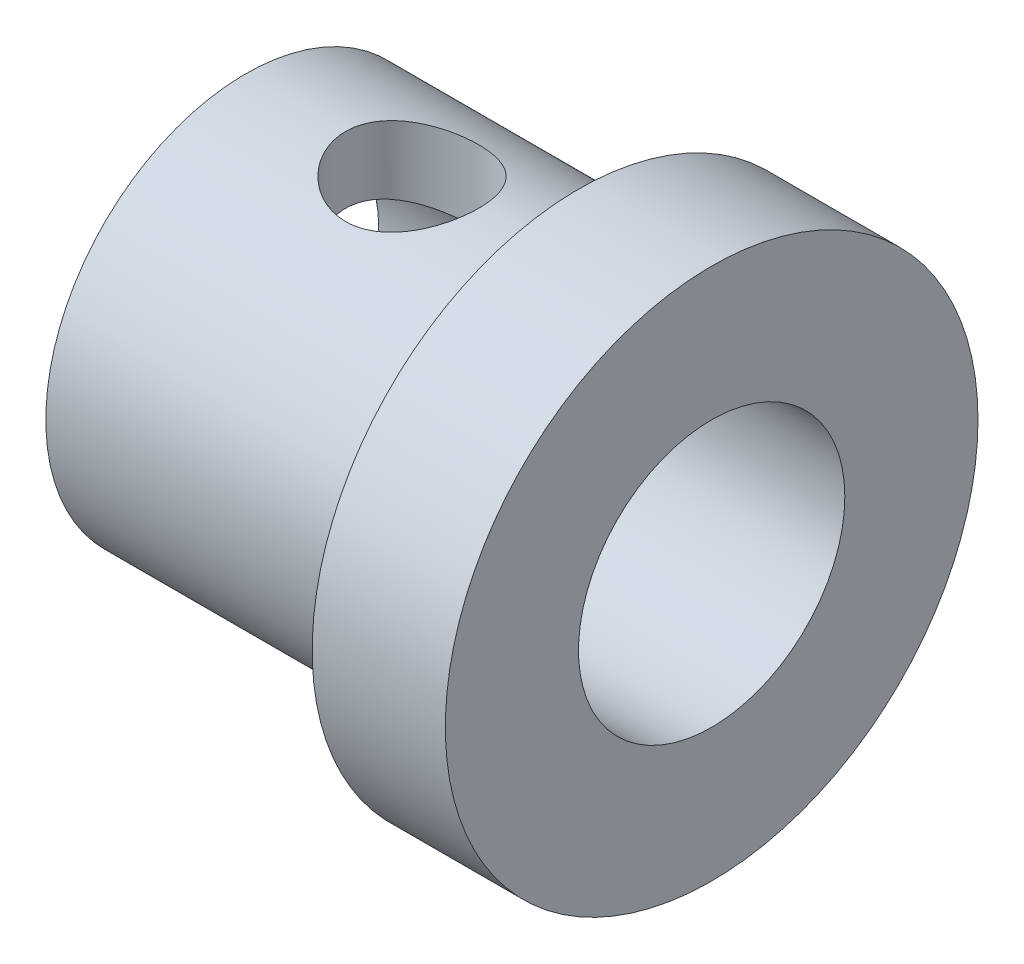
ISO-10303-21;
HEADER;
FILE_DESCRIPTION(('STEP AP214'),'2;1');
FILE_NAME('part.step','',(''),(''),'','','');
FILE_SCHEMA(('AUTOMOTIVE_DESIGN { 1 0 10303 214 1 1 1 1 }'));
ENDSEC;
DATA;
#1=APPLICATION_CONTEXT('core data for automotive mechanical design processes');
#2=APPLICATION_PROTOCOL_DEFINITION('international standard','automotive_design',2000,#1);
#3=PRODUCT_CONTEXT('',#1,'mechanical');
#4=PRODUCT('Part','Part','',(#3));
#5=PRODUCT_RELATED_PRODUCT_CATEGORY('part','',(#4));
#6=PRODUCT_DEFINITION_FORMATION('','',#4);
#7=PRODUCT_DEFINITION_CONTEXT('part definition',#1,'design');
#8=PRODUCT_DEFINITION('design','',#6,#7);
#9=PRODUCT_DEFINITION_SHAPE('','',#8);
#10=(LENGTH_UNIT() NAMED_UNIT(*) SI_UNIT(.MILLI.,.METRE.));
#11=(NAMED_UNIT(*) PLANE_ANGLE_UNIT() SI_UNIT($,.RADIAN.));
#12=(NAMED_UNIT(*) SI_UNIT($,.STERADIAN.) SOLID_ANGLE_UNIT());
#13=UNCERTAINTY_MEASURE_WITH_UNIT(LENGTH_MEASURE(1.E-05),#10,'distance_accuracy_value','');
#14=(GEOMETRIC_REPRESENTATION_CONTEXT(3) GLOBAL_UNCERTAINTY_ASSIGNED_CONTEXT((#13)) GLOBAL_UNIT_ASSIGNED_CONTEXT((#10,
#11,#12)) REPRESENTATION_CONTEXT('',''));
#15=CARTESIAN_POINT('',(0.,0.,0.));
#16=DIRECTION('',(0.,0.,1.));
#17=DIRECTION('',(1.,0.,0.));
#18=AXIS2_PLACEMENT_3D('',#15,#16,#17);
#19=CARTESIAN_POINT('',(3.5,0.,0.));
#20=DIRECTION('',(-1.,0.,0.));
#21=DIRECTION('',(0.,0.,1.));
#22=AXIS2_PLACEMENT_3D('',#19,#20,#21);
#23=CYLINDRICAL_SURFACE('',#22,3.);
#24=CARTESIAN_POINT('',(-1.,-2.82842712474619,1.));
#25=CARTESIAN_POINT('',(-0.945531825189323,-2.82842694532735,1.0000002579478));
#26=CARTESIAN_POINT('',(-0.891065200228475,-2.83001769372806,0.99553478369814));
#27=CARTESIAN_POINT('',(-0.783745579049384,-2.8361757417458,0.977851131702564));
#28=CARTESIAN_POINT('',(-0.730892850136063,-2.8407435316722,0.964631512170673));
#29=CARTESIAN_POINT('',(-0.628373106987187,-2.85228203663888,0.929955485680262));
#30=CARTESIAN_POINT('',(-0.578700070553118,-2.8592480396464,0.908515221402));
#31=CARTESIAN_POINT('',(-0.483639951456205,-2.87479122017008,0.858061628442627));
#32=CARTESIAN_POINT('',(-0.438253817447503,-2.88336875305432,0.829046628860522));
#33=CARTESIAN_POINT('',(-0.351280037660512,-2.90154489405589,0.763051146442527));
#34=CARTESIAN_POINT('',(-0.309884571327957,-2.91116894844139,0.725824341377825));
#35=CARTESIAN_POINT('',(-0.233793198775676,-2.93013864801508,0.644987667214489));
#36=CARTESIAN_POINT('',(-0.199098368417716,-2.93948424829099,0.601376775052401));
#37=CARTESIAN_POINT('',(-0.136521102670319,-2.95713866921658,0.507604507964984));
#38=CARTESIAN_POINT('',(-0.108840029382019,-2.96541407701568,0.457301911224518));
#39=CARTESIAN_POINT('',(-0.0624084148725134,-2.9796958677102,0.352431222987481));
#40=CARTESIAN_POINT('',(-0.0436554668231003,-2.98570286203012,0.297864285687214));
#41=CARTESIAN_POINT('',(-0.0162641453676016,-2.99459075431897,0.188028817433492));
#42=CARTESIAN_POINT('',(-0.00729655374299295,-2.99757314777558,0.132850754852967));
#43=CARTESIAN_POINT('',(0.00131629336065927,-3.00043608218249,0.021697874824091));
#44=CARTESIAN_POINT('',(0.000963951652417298,-3.00031742262891,-0.0342767335438929));
#45=CARTESIAN_POINT('',(-0.0088442545660329,-2.99706039618736,-0.143103515193817));
#46=CARTESIAN_POINT('',(-0.0179425284745073,-2.99404064755135,-0.195992048591667));
#47=CARTESIAN_POINT('',(-0.0443929809804541,-2.98546967339714,-0.299443438822161));
#48=CARTESIAN_POINT('',(-0.0617457189797551,-2.97991827631115,-0.350006137779175));
#49=CARTESIAN_POINT('',(-0.104421317306129,-2.96675670293292,-0.448152474842013));
#50=CARTESIAN_POINT('',(-0.129845938546778,-2.9591204252427,-0.495688220968998));
#51=CARTESIAN_POINT('',(-0.187859705448391,-2.94258393038665,-0.585924325527169));
#52=CARTESIAN_POINT('',(-0.220450843326639,-2.93368336200518,-0.628623334384769));
#53=CARTESIAN_POINT('',(-0.293674393460737,-2.9150619185089,-0.710100866551907));
#54=CARTESIAN_POINT('',(-0.334613157845442,-2.90532215172667,-0.748600157067556));
#55=CARTESIAN_POINT('',(-0.422448725722658,-2.88647335245111,-0.81827725959589));
#56=CARTESIAN_POINT('',(-0.469346445713238,-2.8773644173145,-0.849453943273005));
#57=CARTESIAN_POINT('',(-0.568653625615415,-2.86070525135531,-0.903987455042732));
#58=CARTESIAN_POINT('',(-0.621132131367813,-2.85317909338821,-0.927226463651049));
#59=CARTESIAN_POINT('',(-0.729571394266262,-2.84081650878299,-0.964443193299507));
#60=CARTESIAN_POINT('',(-0.785530681221824,-2.83597895501223,-0.978424795755529));
#61=CARTESIAN_POINT('',(-0.896638355400619,-2.8297963630207,-0.996161282090474));
#62=CARTESIAN_POINT('',(-0.951709424745724,-2.82830360315139,-1.00034909550575));
#63=CARTESIAN_POINT('',(-1.06177614911704,-2.828566720628,-0.999605438911605));
#64=CARTESIAN_POINT('',(-1.11677181602476,-2.83032200792768,-0.99467562522726));
#65=CARTESIAN_POINT('',(-1.22315696571116,-2.83673618089379,-0.97622565155183));
#66=CARTESIAN_POINT('',(-1.27460543015064,-2.84129325440593,-0.963006393980555));
#67=CARTESIAN_POINT('',(-1.37454360623938,-2.8526855367127,-0.928713862560596));
#68=CARTESIAN_POINT('',(-1.42303279159083,-2.85952114934907,-0.907639196363457));
#69=CARTESIAN_POINT('',(-1.51738042084694,-2.87496877595718,-0.857474340738901));
#70=CARTESIAN_POINT('',(-1.56310664264179,-2.8836302566561,-0.828151118358487));
#71=CARTESIAN_POINT('',(-1.64914605238373,-2.90165768730984,-0.762585630557568));
#72=CARTESIAN_POINT('',(-1.68945763866122,-2.91102384443799,-0.726341325498785));
#73=CARTESIAN_POINT('',(-1.76552798409063,-2.92995038637844,-0.645891705900323));
#74=CARTESIAN_POINT('',(-1.80097439001885,-2.93949843577895,-0.601387270546652));
#75=CARTESIAN_POINT('',(-1.86391614234804,-2.9572685161311,-0.506827291400258));
#76=CARTESIAN_POINT('',(-1.89141177116242,-2.96549059417695,-0.456771944864553));
#77=CARTESIAN_POINT('',(-1.93742010486171,-2.97964405810603,-0.352779862432296));
#78=CARTESIAN_POINT('',(-1.95599127714807,-2.98559030004531,-0.298871123321197));
#79=CARTESIAN_POINT('',(-1.9837277420601,-2.99458610837774,-0.188458465846017));
#80=CARTESIAN_POINT('',(-1.9928964298805,-2.99763672034018,-0.13195549195389));
#81=CARTESIAN_POINT('',(-2.00126207760564,-3.00041863236257,-0.0208153358600414));
#82=CARTESIAN_POINT('',(-2.00090745393238,-3.00029920089441,0.0337847239200184));
#83=CARTESIAN_POINT('',(-1.99134269185359,-2.99712196519396,0.142111145000173));
#84=CARTESIAN_POINT('',(-1.98213327184724,-2.99406439933567,0.195837576819055));
#85=CARTESIAN_POINT('',(-1.95541776542403,-2.98540914954421,0.30004211943206));
#86=CARTESIAN_POINT('',(-1.93804578464705,-2.9798525836118,0.350558270912795));
#87=CARTESIAN_POINT('',(-1.89562246890286,-2.96677160704464,0.447978350939789));
#88=CARTESIAN_POINT('',(-1.87056974480306,-2.95924684047901,0.494881624142409));
#89=CARTESIAN_POINT('',(-1.81243048789792,-2.94265868828001,0.585634016308808));
#90=CARTESIAN_POINT('',(-1.77908131461808,-2.93354872492381,0.629306251557696));
#91=CARTESIAN_POINT('',(-1.70574260884409,-2.91492988791425,0.710581026272338));
#92=CARTESIAN_POINT('',(-1.66575095773832,-2.90542088771397,0.748181621624259));
#93=CARTESIAN_POINT('',(-1.57839064441197,-2.88663279827365,0.817741808833464));
#94=CARTESIAN_POINT('',(-1.53079448901923,-2.87737727995345,0.849422965999216));
#95=CARTESIAN_POINT('',(-1.43066557310135,-2.86060193316303,0.904314343299799));
#96=CARTESIAN_POINT('',(-1.37813410698576,-2.8530816513617,0.927526776814559));
#97=CARTESIAN_POINT('',(-1.27203817597617,-2.84101334230535,0.963843828206626));
#98=CARTESIAN_POINT('',(-1.21862773643428,-2.83634632944799,0.977357909163268));
#99=CARTESIAN_POINT('',(-1.11014394948452,-2.8300538361394,0.995434320161694));
#100=CARTESIAN_POINT('',(-1.05507118256425,-2.82842730615135,0.999999739196501));
#101=CARTESIAN_POINT('',(-1.,-2.82842712474619,1.));
#102=B_SPLINE_CURVE_WITH_KNOTS('',3,(#24,#25,#26,#27,#28,#29,#30,#31,#32,#33,#34,#35,#36,#37,
#38,#39,#40,#41,#42,#43,#44,#45,#46,#47,#48,#49,#50,#51,#52,#53,#54,#55,#56,#57,#58,#59,#60,#61,
#62,#63,#64,#65,#66,#67,#68,#69,#70,#71,#72,#73,#74,#75,#76,#77,#78,#79,#80,#81,#82,#83,#84,#85,
#86,#87,#88,#89,#90,#91,#92,#93,#94,#95,#96,#97,#98,#99,#100,#101),.UNSPECIFIED.,.T.,.F.,(4,2,2,
2,2,2,2,2,2,2,2,2,2,2,2,2,2,2,2,2,2,2,2,2,2,2,2,2,2,2,2,2,2,2,2,2,2,2,4),(0.,0.163200584775417,
0.32642805496888,0.489336627454544,0.652281166139158,0.821013374229398,0.989772651673596,
1.16293506139029,1.33605076382161,1.50314318760306,1.67019253297699,1.83069004820941,
1.99119844184608,2.15381654855707,2.31647991869394,2.48680174359289,2.65714979607478,
2.82992639837376,3.00263051349689,3.16754291357512,3.33242535830307,3.49164395761849,
3.65089079140019,3.81518857728788,3.979534856552,4.15178808164165,4.32403518750605,
4.49513791183924,4.66617882997229,4.82918084670708,4.99216964002854,5.15256956033503,
5.31299850756315,5.47935519513706,5.64576504425704,5.81868902729217,5.99156778259939,
6.15663212153686,6.32163947179229),.UNSPECIFIED.);
#103=CARTESIAN_POINT('',(-1.,-2.82842712474619,1.));
#104=VERTEX_POINT('',#103);
#105=EDGE_CURVE('E74',#104,#104,#102,.T.);
#106=ORIENTED_EDGE('',*,*,#105,.T.);
#107=EDGE_LOOP('',(#106));
#108=FACE_BOUND('',#107,.T.);
#109=CARTESIAN_POINT('',(-1.,2.82842712474619,1.));
#110=CARTESIAN_POINT('',(-1.05446817481068,2.82842694532735,1.0000002579478));
#111=CARTESIAN_POINT('',(-1.10893479977153,2.83001769372806,0.99553478369814));
#112=CARTESIAN_POINT('',(-1.21625442095062,2.8361757417458,0.977851131702564));
#113=CARTESIAN_POINT('',(-1.26910714986394,2.8407435316722,0.964631512170673));
#114=CARTESIAN_POINT('',(-1.37162689301281,2.85228203663888,0.929955485680262));
#115=CARTESIAN_POINT('',(-1.42129992944688,2.8592480396464,0.908515221402));
#116=CARTESIAN_POINT('',(-1.5163600485438,2.87479122017008,0.858061628442627));
#117=CARTESIAN_POINT('',(-1.5617461825525,2.88336875305432,0.829046628860522));
#118=CARTESIAN_POINT('',(-1.64871996233949,2.90154489405589,0.763051146442527));
#119=CARTESIAN_POINT('',(-1.69011542867204,2.91116894844139,0.725824341377825));
#120=CARTESIAN_POINT('',(-1.76620680122432,2.93013864801508,0.644987667214489));
#121=CARTESIAN_POINT('',(-1.80090163158228,2.93948424829099,0.601376775052401));
#122=CARTESIAN_POINT('',(-1.86347889732968,2.95713866921658,0.507604507964984));
#123=CARTESIAN_POINT('',(-1.89115997061798,2.96541407701568,0.457301911224518));
#124=CARTESIAN_POINT('',(-1.93759158512749,2.9796958677102,0.352431222987481));
#125=CARTESIAN_POINT('',(-1.9563445331769,2.98570286203012,0.297864285687214));
#126=CARTESIAN_POINT('',(-1.9837358546324,2.99459075431897,0.188028817433492));
#127=CARTESIAN_POINT('',(-1.99270344625701,2.99757314777558,0.132850754852967));
#128=CARTESIAN_POINT('',(-2.00131629336066,3.00043608218249,0.0216978748240908));
#129=CARTESIAN_POINT('',(-2.00096395165242,3.00031742262891,-0.0342767335438932));
#130=CARTESIAN_POINT('',(-1.99115574543397,2.99706039618736,-0.143103515193818));
#131=CARTESIAN_POINT('',(-1.98205747152549,2.99404064755135,-0.195992048591667));
#132=CARTESIAN_POINT('',(-1.95560701901955,2.98546967339714,-0.299443438822161));
#133=CARTESIAN_POINT('',(-1.93825428102024,2.97991827631115,-0.350006137779176));
#134=CARTESIAN_POINT('',(-1.89557868269387,2.96675670293292,-0.448152474842014));
#135=CARTESIAN_POINT('',(-1.87015406145322,2.9591204252427,-0.495688220968998));
#136=CARTESIAN_POINT('',(-1.81214029455161,2.94258393038665,-0.585924325527169));
#137=CARTESIAN_POINT('',(-1.77954915667336,2.93368336200518,-0.62862333438477));
#138=CARTESIAN_POINT('',(-1.70632560653926,2.9150619185089,-0.710100866551907));
#139=CARTESIAN_POINT('',(-1.66538684215456,2.90532215172667,-0.748600157067556));
#140=CARTESIAN_POINT('',(-1.57755127427734,2.88647335245111,-0.81827725959589));
#141=CARTESIAN_POINT('',(-1.53065355428676,2.8773644173145,-0.849453943273005));
#142=CARTESIAN_POINT('',(-1.43134637438458,2.86070525135531,-0.903987455042732));
#143=CARTESIAN_POINT('',(-1.37886786863219,2.85317909338821,-0.927226463651049));
#144=CARTESIAN_POINT('',(-1.27042860573374,2.84081650878299,-0.964443193299506));
#145=CARTESIAN_POINT('',(-1.21446931877818,2.83597895501223,-0.978424795755529));
#146=CARTESIAN_POINT('',(-1.10336164459938,2.8297963630207,-0.996161282090474));
#147=CARTESIAN_POINT('',(-1.04829057525428,2.82830360315139,-1.00034909550575));
#148=CARTESIAN_POINT('',(-0.938223850882962,2.828566720628,-0.999605438911605));
#149=CARTESIAN_POINT('',(-0.883228183975239,2.83032200792768,-0.99467562522726));
#150=CARTESIAN_POINT('',(-0.776843034288837,2.83673618089379,-0.97622565155183));
#151=CARTESIAN_POINT('',(-0.725394569849359,2.84129325440593,-0.963006393980555));
#152=CARTESIAN_POINT('',(-0.625456393760615,2.8526855367127,-0.928713862560596));
#153=CARTESIAN_POINT('',(-0.576967208409165,2.85952114934907,-0.907639196363457));
#154=CARTESIAN_POINT('',(-0.482619579153058,2.87496877595718,-0.8574743407389));
#155=CARTESIAN_POINT('',(-0.436893357358213,2.8836302566561,-0.828151118358487));
#156=CARTESIAN_POINT('',(-0.350853947616266,2.90165768730984,-0.762585630557568));
#157=CARTESIAN_POINT('',(-0.310542361338776,2.911023844438,-0.726341325498784));
#158=CARTESIAN_POINT('',(-0.234472015909366,2.92995038637844,-0.645891705900322));
#159=CARTESIAN_POINT('',(-0.199025609981151,2.93949843577895,-0.601387270546651));
#160=CARTESIAN_POINT('',(-0.136083857651956,2.9572685161311,-0.506827291400257));
#161=CARTESIAN_POINT('',(-0.108588228837575,2.96549059417695,-0.456771944864552));
#162=CARTESIAN_POINT('',(-0.0625798951382853,2.97964405810603,-0.352779862432295));
#163=CARTESIAN_POINT('',(-0.0440087228519346,2.98559030004531,-0.298871123321196));
#164=CARTESIAN_POINT('',(-0.0162722579398952,2.99458610837774,-0.188458465846016));
#165=CARTESIAN_POINT('',(-0.00710357011949715,2.99763672034018,-0.131955491953889));
#166=CARTESIAN_POINT('',(0.00126207760564165,3.00041863236257,-0.0208153358600403));
#167=CARTESIAN_POINT('',(0.000907453932375728,3.00029920089441,0.0337847239200195));
#168=CARTESIAN_POINT('',(-0.00865730814640739,2.99712196519396,0.142111145000174));
#169=CARTESIAN_POINT('',(-0.017866728152764,2.99406439933567,0.195837576819056));
#170=CARTESIAN_POINT('',(-0.044582234575968,2.98540914954421,0.300042119432061));
#171=CARTESIAN_POINT('',(-0.0619542153529523,2.9798525836118,0.350558270912796));
#172=CARTESIAN_POINT('',(-0.104377531097136,2.96677160704464,0.44797835093979));
#173=CARTESIAN_POINT('',(-0.129430255196942,2.95924684047901,0.49488162414241));
#174=CARTESIAN_POINT('',(-0.187569512102081,2.94265868828001,0.585634016308809));
#175=CARTESIAN_POINT('',(-0.22091868538192,2.93354872492381,0.629306251557697));
#176=CARTESIAN_POINT('',(-0.294257391155915,2.91492988791425,0.710581026272338));
#177=CARTESIAN_POINT('',(-0.334249042261683,2.90542088771397,0.748181621624259));
#178=CARTESIAN_POINT('',(-0.421609355588035,2.88663279827365,0.817741808833464));
#179=CARTESIAN_POINT('',(-0.469205510980768,2.87737727995345,0.849422965999217));
#180=CARTESIAN_POINT('',(-0.569334426898653,2.86060193316303,0.904314343299799));
#181=CARTESIAN_POINT('',(-0.621865893014244,2.8530816513617,0.927526776814559));
#182=CARTESIAN_POINT('',(-0.727961824023833,2.84101334230535,0.963843828206626));
#183=CARTESIAN_POINT('',(-0.781372263565723,2.83634632944799,0.977357909163268));
#184=CARTESIAN_POINT('',(-0.889856050515475,2.8300538361394,0.995434320161694));
#185=CARTESIAN_POINT('',(-0.944928817435749,2.82842730615135,0.999999739196501));
#186=CARTESIAN_POINT('',(-1.,2.82842712474619,1.));
#187=B_SPLINE_CURVE_WITH_KNOTS('',3,(#109,#110,#111,#112,#113,#114,#115,#116,#117,#118,#119,
#120,#121,#122,#123,#124,#125,#126,#127,#128,#129,#130,#131,#132,#133,#134,#135,#136,#137,#138,
#139,#140,#141,#142,#143,#144,#145,#146,#147,#148,#149,#150,#151,#152,#153,#154,#155,#156,#157,
#158,#159,#160,#161,#162,#163,#164,#165,#166,#167,#168,#169,#170,#171,#172,#173,#174,#175,#176,
#177,#178,#179,#180,#181,#182,#183,#184,#185,#186),.UNSPECIFIED.,.T.,.F.,(4,2,2,2,2,2,2,2,2,2,2,
2,2,2,2,2,2,2,2,2,2,2,2,2,2,2,2,2,2,2,2,2,2,2,2,2,2,2,4),(0.,0.163200584775417,0.32642805496888,
0.489336627454544,0.652281166139158,0.821013374229397,0.989772651673596,1.16293506139029,
1.33605076382161,1.50314318760306,1.67019253297699,1.83069004820941,1.99119844184608,
2.15381654855707,2.31647991869394,2.48680174359289,2.65714979607478,2.82992639837376,
3.00263051349688,3.16754291357512,3.33242535830307,3.49164395761849,3.65089079140019,
3.81518857728788,3.979534856552,4.15178808164165,4.32403518750605,4.49513791183924,
4.66617882997229,4.82918084670708,4.99216964002854,5.15256956033503,5.31299850756315,
5.47935519513706,5.64576504425704,5.81868902729217,5.99156778259939,6.15663212153686,
6.32163947179229),.UNSPECIFIED.);
#188=CARTESIAN_POINT('',(-1.,2.82842712474619,1.));
#189=VERTEX_POINT('',#188);
#190=EDGE_CURVE('E69',#189,#189,#187,.T.);
#191=ORIENTED_EDGE('',*,*,#190,.T.);
#192=EDGE_LOOP('',(#191));
#193=FACE_BOUND('',#192,.T.);
#194=CARTESIAN_POINT('',(-3.5,0.,0.));
#195=DIRECTION('',(1.,0.,0.));
#196=DIRECTION('',(0.,0.,-1.));
#197=AXIS2_PLACEMENT_3D('',#194,#195,#196);
#198=CIRCLE('',#197,3.);
#199=CARTESIAN_POINT('',(-3.5,0.,-3.));
#200=VERTEX_POINT('',#199);
#201=EDGE_CURVE('E43',#200,#200,#198,.T.);
#202=ORIENTED_EDGE('',*,*,#201,.T.);
#203=EDGE_LOOP('',(#202));
#204=FACE_BOUND('',#203,.T.);
#205=CARTESIAN_POINT('',(1.5,0.,0.));
#206=DIRECTION('',(1.,0.,0.));
#207=DIRECTION('',(0.,0.,-1.));
#208=AXIS2_PLACEMENT_3D('',#205,#206,#207);
#209=CIRCLE('',#208,3.);
#210=CARTESIAN_POINT('',(1.5,0.,-3.));
#211=VERTEX_POINT('',#210);
#212=EDGE_CURVE('E10',#211,#211,#209,.T.);
#213=ORIENTED_EDGE('',*,*,#212,.F.);
#214=EDGE_LOOP('',(#213));
#215=FACE_BOUND('',#214,.T.);
#216=ADVANCED_FACE('F30',(#108,#193,#204,#215),#23,.T.);
#217=CARTESIAN_POINT('',(-3.5,0.,0.));
#218=DIRECTION('',(1.,0.,0.));
#219=DIRECTION('',(0.,0.,-1.));
#220=AXIS2_PLACEMENT_3D('',#217,#218,#219);
#221=PLANE('',#220);
#222=CARTESIAN_POINT('',(-3.5,0.,0.));
#223=DIRECTION('',(1.,0.,0.));
#224=DIRECTION('',(0.,0.,-1.));
#225=AXIS2_PLACEMENT_3D('',#222,#223,#224);
#226=CIRCLE('',#225,2.);
#227=CARTESIAN_POINT('',(-3.5,0.,-2.));
#228=VERTEX_POINT('',#227);
#229=EDGE_CURVE('E81',#228,#228,#226,.T.);
#230=ORIENTED_EDGE('',*,*,#229,.T.);
#231=EDGE_LOOP('',(#230));
#232=FACE_BOUND('',#231,.T.);
#233=ORIENTED_EDGE('',*,*,#201,.F.);
#234=EDGE_LOOP('',(#233));
#235=FACE_BOUND('',#234,.T.);
#236=ADVANCED_FACE('F96',(#232,#235),#221,.F.);
#237=CARTESIAN_POINT('',(1.5,0.,0.));
#238=DIRECTION('',(1.,0.,0.));
#239=DIRECTION('',(0.,0.,-1.));
#240=AXIS2_PLACEMENT_3D('',#237,#238,#239);
#241=CYLINDRICAL_SURFACE('',#240,4.);
#242=CARTESIAN_POINT('',(1.5,0.,0.));
#243=DIRECTION('',(1.,0.,0.));
#244=DIRECTION('',(0.,0.,-1.));
#245=AXIS2_PLACEMENT_3D('',#242,#243,#244);
#246=CIRCLE('',#245,4.);
#247=CARTESIAN_POINT('',(1.5,0.,-4.));
#248=VERTEX_POINT('',#247);
#249=EDGE_CURVE('E48',#248,#248,#246,.T.);
#250=ORIENTED_EDGE('',*,*,#249,.T.);
#251=EDGE_LOOP('',(#250));
#252=FACE_BOUND('',#251,.T.);
#253=CARTESIAN_POINT('',(3.5,0.,0.));
#254=DIRECTION('',(1.,0.,0.));
#255=DIRECTION('',(0.,0.,-1.));
#256=AXIS2_PLACEMENT_3D('',#253,#254,#255);
#257=CIRCLE('',#256,4.);
#258=CARTESIAN_POINT('',(3.5,0.,-4.));
#259=VERTEX_POINT('',#258);
#260=EDGE_CURVE('E84',#259,#259,#257,.T.);
#261=ORIENTED_EDGE('',*,*,#260,.F.);
#262=EDGE_LOOP('',(#261));
#263=FACE_BOUND('',#262,.T.);
#264=ADVANCED_FACE('F93',(#252,#263),#241,.T.);
#265=CARTESIAN_POINT('',(1.5,0.,0.));
#266=DIRECTION('',(1.,0.,0.));
#267=DIRECTION('',(0.,0.,-1.));
#268=AXIS2_PLACEMENT_3D('',#265,#266,#267);
#269=PLANE('',#268);
#270=ORIENTED_EDGE('',*,*,#212,.T.);
#271=EDGE_LOOP('',(#270));
#272=FACE_BOUND('',#271,.T.);
#273=ORIENTED_EDGE('',*,*,#249,.F.);
#274=EDGE_LOOP('',(#273));
#275=FACE_BOUND('',#274,.T.);
#276=ADVANCED_FACE('F95',(#272,#275),#269,.F.);
#277=CARTESIAN_POINT('',(3.5,0.,0.));
#278=DIRECTION('',(1.,0.,0.));
#279=DIRECTION('',(0.,0.,-1.));
#280=AXIS2_PLACEMENT_3D('',#277,#278,#279);
#281=PLANE('',#280);
#282=CARTESIAN_POINT('',(3.5,0.,0.));
#283=DIRECTION('',(1.,0.,0.));
#284=DIRECTION('',(0.,0.,-1.));
#285=AXIS2_PLACEMENT_3D('',#282,#283,#284);
#286=CIRCLE('',#285,2.);
#287=CARTESIAN_POINT('',(3.5,0.,-2.));
#288=VERTEX_POINT('',#287);
#289=EDGE_CURVE('E80',#288,#288,#286,.T.);
#290=ORIENTED_EDGE('',*,*,#289,.F.);
#291=EDGE_LOOP('',(#290));
#292=FACE_BOUND('',#291,.T.);
#293=ORIENTED_EDGE('',*,*,#260,.T.);
#294=EDGE_LOOP('',(#293));
#295=FACE_BOUND('',#294,.T.);
#296=ADVANCED_FACE('F91',(#292,#295),#281,.T.);
#297=CARTESIAN_POINT('',(-3.5,0.,0.));
#298=DIRECTION('',(1.,0.,0.));
#299=DIRECTION('',(0.,0.,-1.));
#300=AXIS2_PLACEMENT_3D('',#297,#298,#299);
#301=CYLINDRICAL_SURFACE('',#300,2.);
#302=CARTESIAN_POINT('',(-1.,-1.73205080756888,1.));
#303=CARTESIAN_POINT('',(-1.05210780819525,-1.73205534728459,0.999996363074532));
#304=CARTESIAN_POINT('',(-1.10428141152505,-1.73443801187756,0.995899970733216));
#305=CARTESIAN_POINT('',(-1.20702726467715,-1.74362366452052,0.979723209898053));
#306=CARTESIAN_POINT('',(-1.25759591504341,-1.75043594055559,0.967626064554179));
#307=CARTESIAN_POINT('',(-1.35545166434394,-1.76749346605398,0.936099948699812));
#308=CARTESIAN_POINT('',(-1.40275465247359,-1.77772043473252,0.916709952493731));
#309=CARTESIAN_POINT('',(-1.49342420199672,-1.80042664816858,0.871267525376372));
#310=CARTESIAN_POINT('',(-1.53679055026246,-1.81290601476065,0.845214734035773));
#311=CARTESIAN_POINT('',(-1.62230572855751,-1.83996869057441,0.784666540530879));
#312=CARTESIAN_POINT('',(-1.66405913567354,-1.85464063637954,0.74965203614377));
#313=CARTESIAN_POINT('',(-1.74140838840671,-1.88371982785706,0.673253807614468));
#314=CARTESIAN_POINT('',(-1.77700116258352,-1.8981269383125,0.631866925782293));
#315=CARTESIAN_POINT('',(-1.84336715114766,-1.92621476952949,0.540489563414546));
#316=CARTESIAN_POINT('',(-1.87365376785953,-1.93978106418172,0.490107189012575));
#317=CARTESIAN_POINT('',(-1.92514085324576,-1.96350756099529,0.384157026599504));
#318=CARTESIAN_POINT('',(-1.94634705613717,-1.97366991183742,0.328592538138155));
#319=CARTESIAN_POINT('',(-1.9775046613011,-1.98880461244237,0.218044943925977));
#320=CARTESIAN_POINT('',(-1.98814952635553,-1.99409480220892,0.163301790488817));
#321=CARTESIAN_POINT('',(-2.00016611867504,-2.00007583846067,0.052570628697848));
#322=CARTESIAN_POINT('',(-2.00154345679571,-2.0007694678459,-0.00341660584373864));
#323=CARTESIAN_POINT('',(-1.99525332602965,-1.9976298191645,-0.10983252442375));
#324=CARTESIAN_POINT('',(-1.98836198447878,-1.9941849589216,-0.160321199176792));
#325=CARTESIAN_POINT('',(-1.96711915609534,-1.98374245259747,-0.259313771918322));
#326=CARTESIAN_POINT('',(-1.95276711102378,-1.97674454066394,-0.307817521093926));
#327=CARTESIAN_POINT('',(-1.91691743391019,-1.95971583287654,-0.402309391569554));
#328=CARTESIAN_POINT('',(-1.89532368682793,-1.94964441529199,-0.448253423515179));
#329=CARTESIAN_POINT('',(-1.84573658379851,-1.92737645986687,-0.535976801513329));
#330=CARTESIAN_POINT('',(-1.81774093669765,-1.91517916157484,-0.577754648838646));
#331=CARTESIAN_POINT('',(-1.75310464846698,-1.88844394399229,-0.660173660898195));
#332=CARTESIAN_POINT('',(-1.71589697167399,-1.87379375998175,-0.70033407502936));
#333=CARTESIAN_POINT('',(-1.63541027506982,-1.84454340586812,-0.77410437029778));
#334=CARTESIAN_POINT('',(-1.59212662772594,-1.82994328265629,-0.807709211574231));
#335=CARTESIAN_POINT('',(-1.49735180757591,-1.80144156092485,-0.869505334642211));
#336=CARTESIAN_POINT('',(-1.44551397694579,-1.78764319990708,-0.897217314978051));
#337=CARTESIAN_POINT('',(-1.337062328641,-1.76375450278576,-0.943319113001231));
#338=CARTESIAN_POINT('',(-1.28045356698244,-1.75366030046067,-0.96171865821089));
#339=CARTESIAN_POINT('',(-1.16878548871721,-1.73944635817034,-0.98718021102504));
#340=CARTESIAN_POINT('',(-1.11395888095645,-1.73491655848496,-0.995025122119976));
#341=CARTESIAN_POINT('',(-1.00359865848346,-1.7311791936161,-1.00151694661143));
#342=CARTESIAN_POINT('',(-0.948065570880213,-1.73196786889312,-1.00017035731503));
#343=CARTESIAN_POINT('',(-0.844346081421271,-1.73834336540585,-0.989036043343966));
#344=CARTESIAN_POINT('',(-0.796020548892072,-1.74339587506654,-0.980187816712467));
#345=CARTESIAN_POINT('',(-0.701632213729041,-1.75694021551341,-0.955696284632441));
#346=CARTESIAN_POINT('',(-0.655570149253391,-1.76543316005034,-0.940050778623614));
#347=CARTESIAN_POINT('',(-0.564588669097304,-1.78536222079657,-0.901647588604886));
#348=CARTESIAN_POINT('',(-0.519820983146448,-1.79691643243063,-0.878594063692723));
#349=CARTESIAN_POINT('',(-0.434530728461006,-1.8215611949725,-0.826287064015804));
#350=CARTESIAN_POINT('',(-0.394010356486717,-1.83465253355148,-0.797030404332216));
#351=CARTESIAN_POINT('',(-0.313021232476452,-1.86287998456336,-0.728837167198853));
#352=CARTESIAN_POINT('',(-0.273202849282341,-1.87806583154289,-0.689145272314967));
#353=CARTESIAN_POINT('',(-0.200587762006409,-1.90734234977892,-0.603404495398289));
#354=CARTESIAN_POINT('',(-0.16779342976946,-1.92143265007709,-0.557353474655347));
#355=CARTESIAN_POINT('',(-0.109426274049898,-1.94741361690957,-0.458535362558757));
#356=CARTESIAN_POINT('',(-0.0840668817890901,-1.95923641672029,-0.405623097574113));
#357=CARTESIAN_POINT('',(-0.0428620961426075,-1.97883354959301,-0.295522364641082));
#358=CARTESIAN_POINT('',(-0.0270083486336953,-1.98661143676373,-0.238337701392176));
#359=CARTESIAN_POINT('',(-0.00663143582533834,-1.99667508181883,-0.126979682330417));
#360=CARTESIAN_POINT('',(-0.00120212412388639,-1.99939927908191,-0.0730114438504571));
#361=CARTESIAN_POINT('',(0.000843265454401297,-2.00042130375131,0.0351259859512035));
#362=CARTESIAN_POINT('',(-0.00253757147643628,-1.9987206806689,0.0892951002950868));
#363=CARTESIAN_POINT('',(-0.0174164067956242,-1.99133968837923,0.192537992317147));
#364=CARTESIAN_POINT('',(-0.0283648492576712,-1.9859289466799,0.241712317811264));
#365=CARTESIAN_POINT('',(-0.0573269993029709,-1.97192093663423,0.337445952183618));
#366=CARTESIAN_POINT('',(-0.0753417200934528,-1.96332321132796,0.384004884955509));
#367=CARTESIAN_POINT('',(-0.118727052165973,-1.9432593074812,0.475423406244885));
#368=CARTESIAN_POINT('',(-0.144379323207839,-1.93168617198799,0.520125142700046));
#369=CARTESIAN_POINT('',(-0.20195793085905,-1.90688133141826,0.604774641814025));
#370=CARTESIAN_POINT('',(-0.233887149115673,-1.89364886558361,0.644720207414907));
#371=CARTESIAN_POINT('',(-0.306797139022702,-1.86528610226628,0.722914004156891));
#372=CARTESIAN_POINT('',(-0.348362487477192,-1.85009799011698,0.760597684539272));
#373=CARTESIAN_POINT('',(-0.43745072112977,-1.82063076162852,0.828663287394675));
#374=CARTESIAN_POINT('',(-0.484978820867684,-1.80635245761865,0.859038750010058));
#375=CARTESIAN_POINT('',(-0.586636646580955,-1.77999605304916,0.912431079785654));
#376=CARTESIAN_POINT('',(-0.640927531128736,-1.7680017425627,0.935185065960939));
#377=CARTESIAN_POINT('',(-0.753332404339778,-1.74866156328352,0.970878709506412));
#378=CARTESIAN_POINT('',(-0.811432888912687,-1.74130016147702,0.983851191175346));
#379=CARTESIAN_POINT('',(-0.891805355651996,-1.7352927260179,0.994367007864415));
#380=CARTESIAN_POINT('',(-0.913367894397883,-1.73408129005152,0.996476104963851));
#381=CARTESIAN_POINT('',(-0.956616480682243,-1.7324593588775,0.999293405089963));
#382=CARTESIAN_POINT('',(-0.978302536385874,-1.73204891725109,1.00000151439987));
#383=CARTESIAN_POINT('',(-1.,-1.73205080756888,1.));
#384=B_SPLINE_CURVE_WITH_KNOTS('',3,(#302,#303,#304,#305,#306,#307,#308,#309,#310,#311,#312,
#313,#314,#315,#316,#317,#318,#319,#320,#321,#322,#323,#324,#325,#326,#327,#328,#329,#330,#331,
#332,#333,#334,#335,#336,#337,#338,#339,#340,#341,#342,#343,#344,#345,#346,#347,#348,#349,#350,
#351,#352,#353,#354,#355,#356,#357,#358,#359,#360,#361,#362,#363,#364,#365,#366,#367,#368,#369,
#370,#371,#372,#373,#374,#375,#376,#377,#378,#379,#380,#381,#382,#383),.UNSPECIFIED.,.T.,.F.,(4,
2,2,2,2,2,2,2,2,2,2,2,2,2,2,2,2,2,2,2,2,2,2,2,2,2,2,2,2,2,2,2,2,2,2,2,2,2,2,2,4),(0.,
0.156232122594715,0.312792892824805,0.468528595918886,0.62427272544515,0.792862312498234,
0.96153571084371,1.14157892238763,1.32150826963891,1.48863484967935,1.6556602368604,
1.80816097484538,1.96067312517455,2.11529534731147,2.26997299350272,2.43927191456891,
2.60870048245919,2.78888841729448,2.96888774211705,3.13462290854212,3.30024093188373,
3.44774183424026,3.59529052436063,3.74967296406088,3.90413486220047,4.07806743580613,
4.25205864978202,4.43064181412966,4.60906779808772,4.77112270389487,4.93312086793972,
5.08444424871493,5.23578933512013,5.39360750719472,5.55149830100719,5.72510241850067,
5.89885942845154,6.07810749038605,6.2567513300276,6.32180135185309,6.38685572494541),.UNSPECIFIED.);
#385=CARTESIAN_POINT('',(-1.,-1.73205080756888,1.));
#386=VERTEX_POINT('',#385);
#387=EDGE_CURVE('E34',#386,#386,#384,.T.);
#388=ORIENTED_EDGE('',*,*,#387,.T.);
#389=EDGE_LOOP('',(#388));
#390=FACE_BOUND('',#389,.T.);
#391=CARTESIAN_POINT('',(-1.,1.73205080756888,1.));
#392=CARTESIAN_POINT('',(-0.94789219180475,1.73205534728459,0.999996363074532));
#393=CARTESIAN_POINT('',(-0.895718588474955,1.73443801187756,0.995899970733217));
#394=CARTESIAN_POINT('',(-0.792972735322847,1.74362366452052,0.979723209898053));
#395=CARTESIAN_POINT('',(-0.742404084956592,1.75043594055559,0.967626064554179));
#396=CARTESIAN_POINT('',(-0.644548335656059,1.76749346605398,0.936099948699812));
#397=CARTESIAN_POINT('',(-0.597245347526413,1.77772043473252,0.916709952493731));
#398=CARTESIAN_POINT('',(-0.50657579800328,1.80042664816858,0.871267525376372));
#399=CARTESIAN_POINT('',(-0.463209449737543,1.81290601476065,0.845214734035773));
#400=CARTESIAN_POINT('',(-0.377694271442494,1.83996869057441,0.784666540530879));
#401=CARTESIAN_POINT('',(-0.335940864326456,1.85464063637954,0.74965203614377));
#402=CARTESIAN_POINT('',(-0.25859161159329,1.88371982785706,0.673253807614468));
#403=CARTESIAN_POINT('',(-0.222998837416479,1.8981269383125,0.631866925782293));
#404=CARTESIAN_POINT('',(-0.156632848852337,1.92621476952949,0.540489563414546));
#405=CARTESIAN_POINT('',(-0.12634623214047,1.93978106418172,0.490107189012575));
#406=CARTESIAN_POINT('',(-0.0748591467542375,1.96350756099529,0.384157026599504));
#407=CARTESIAN_POINT('',(-0.0536529438628298,1.97366991183742,0.328592538138155));
#408=CARTESIAN_POINT('',(-0.0224953386989027,1.98880461244237,0.218044943925977));
#409=CARTESIAN_POINT('',(-0.0118504736444669,1.99409480220892,0.163301790488817));
#410=CARTESIAN_POINT('',(0.000166118675038055,2.00007583846067,0.0525706286978479));
#411=CARTESIAN_POINT('',(0.00154345679571034,2.0007694678459,-0.00341660584373868));
#412=CARTESIAN_POINT('',(-0.00474667397034944,1.9976298191645,-0.10983252442375));
#413=CARTESIAN_POINT('',(-0.0116380155212226,1.9941849589216,-0.160321199176792));
#414=CARTESIAN_POINT('',(-0.0328808439046572,1.98374245259747,-0.259313771918322));
#415=CARTESIAN_POINT('',(-0.047232888976223,1.97674454066394,-0.307817521093926));
#416=CARTESIAN_POINT('',(-0.0830825660898133,1.95971583287654,-0.402309391569554));
#417=CARTESIAN_POINT('',(-0.104676313172067,1.94964441529199,-0.448253423515179));
#418=CARTESIAN_POINT('',(-0.154263416201493,1.92737645986687,-0.535976801513329));
#419=CARTESIAN_POINT('',(-0.18225906330235,1.91517916157484,-0.577754648838646));
#420=CARTESIAN_POINT('',(-0.246895351533015,1.88844394399229,-0.660173660898195));
#421=CARTESIAN_POINT('',(-0.28410302832601,1.87379375998175,-0.700334075029361));
#422=CARTESIAN_POINT('',(-0.364589724930177,1.84454340586812,-0.77410437029778));
#423=CARTESIAN_POINT('',(-0.407873372274063,1.82994328265629,-0.807709211574231));
#424=CARTESIAN_POINT('',(-0.502648192424088,1.80144156092485,-0.869505334642211));
#425=CARTESIAN_POINT('',(-0.554486023054211,1.78764319990708,-0.897217314978051));
#426=CARTESIAN_POINT('',(-0.662937671358998,1.76375450278576,-0.943319113001232));
#427=CARTESIAN_POINT('',(-0.719546433017562,1.75366030046067,-0.96171865821089));
#428=CARTESIAN_POINT('',(-0.831214511282791,1.73944635817034,-0.98718021102504));
#429=CARTESIAN_POINT('',(-0.886041119043552,1.73491655848496,-0.995025122119976));
#430=CARTESIAN_POINT('',(-0.996401341516542,1.7311791936161,-1.00151694661143));
#431=CARTESIAN_POINT('',(-1.05193442911979,1.73196786889312,-1.00017035731503));
#432=CARTESIAN_POINT('',(-1.15565391857873,1.73834336540585,-0.989036043343966));
#433=CARTESIAN_POINT('',(-1.20397945110793,1.74339587506654,-0.980187816712467));
#434=CARTESIAN_POINT('',(-1.29836778627096,1.75694021551341,-0.955696284632441));
#435=CARTESIAN_POINT('',(-1.34442985074661,1.76543316005034,-0.940050778623614));
#436=CARTESIAN_POINT('',(-1.4354113309027,1.78536222079657,-0.901647588604886));
#437=CARTESIAN_POINT('',(-1.48017901685355,1.79691643243063,-0.878594063692723));
#438=CARTESIAN_POINT('',(-1.56546927153899,1.8215611949725,-0.826287064015804));
#439=CARTESIAN_POINT('',(-1.60598964351328,1.83465253355148,-0.797030404332216));
#440=CARTESIAN_POINT('',(-1.68697876752355,1.86287998456336,-0.728837167198853));
#441=CARTESIAN_POINT('',(-1.72679715071766,1.87806583154289,-0.689145272314966));
#442=CARTESIAN_POINT('',(-1.79941223799359,1.90734234977893,-0.603404495398288));
#443=CARTESIAN_POINT('',(-1.83220657023054,1.92143265007709,-0.557353474655346));
#444=CARTESIAN_POINT('',(-1.8905737259501,1.94741361690957,-0.458535362558757));
#445=CARTESIAN_POINT('',(-1.91593311821091,1.95923641672029,-0.405623097574113));
#446=CARTESIAN_POINT('',(-1.95713790385739,1.97883354959301,-0.295522364641082));
#447=CARTESIAN_POINT('',(-1.97299165136631,1.98661143676373,-0.238337701392176));
#448=CARTESIAN_POINT('',(-1.99336856417466,1.99667508181883,-0.126979682330417));
#449=CARTESIAN_POINT('',(-1.99879787587611,1.99939927908191,-0.0730114438504565));
#450=CARTESIAN_POINT('',(-2.0008432654544,2.00042130375131,0.0351259859512041));
#451=CARTESIAN_POINT('',(-1.99746242852356,1.9987206806689,0.0892951002950873));
#452=CARTESIAN_POINT('',(-1.98258359320438,1.99133968837923,0.192537992317148));
#453=CARTESIAN_POINT('',(-1.97163515074233,1.9859289466799,0.241712317811265));
#454=CARTESIAN_POINT('',(-1.94267300069703,1.97192093663423,0.337445952183618));
#455=CARTESIAN_POINT('',(-1.92465827990655,1.96332321132796,0.384004884955509));
#456=CARTESIAN_POINT('',(-1.88127294783403,1.9432593074812,0.475423406244885));
#457=CARTESIAN_POINT('',(-1.85562067679216,1.93168617198799,0.520125142700047));
#458=CARTESIAN_POINT('',(-1.79804206914095,1.90688133141826,0.604774641814025));
#459=CARTESIAN_POINT('',(-1.76611285088433,1.89364886558361,0.644720207414908));
#460=CARTESIAN_POINT('',(-1.6932028609773,1.86528610226628,0.722914004156892));
#461=CARTESIAN_POINT('',(-1.65163751252281,1.85009799011698,0.760597684539272));
#462=CARTESIAN_POINT('',(-1.56254927887023,1.82063076162852,0.828663287394676));
#463=CARTESIAN_POINT('',(-1.51502117913232,1.80635245761865,0.859038750010059));
#464=CARTESIAN_POINT('',(-1.41336335341904,1.77999605304916,0.912431079785655));
#465=CARTESIAN_POINT('',(-1.35907246887126,1.7680017425627,0.935185065960939));
#466=CARTESIAN_POINT('',(-1.24666759566022,1.74866156328352,0.970878709506412));
#467=CARTESIAN_POINT('',(-1.18856711108731,1.74130016147702,0.983851191175347));
#468=CARTESIAN_POINT('',(-1.108194644348,1.7352927260179,0.994367007864415));
#469=CARTESIAN_POINT('',(-1.08663210560212,1.73408129005152,0.996476104963851));
#470=CARTESIAN_POINT('',(-1.04338351931776,1.7324593588775,0.999293405089963));
#471=CARTESIAN_POINT('',(-1.02169746361413,1.73204891725109,1.00000151439987));
#472=CARTESIAN_POINT('',(-1.,1.73205080756888,1.));
#473=B_SPLINE_CURVE_WITH_KNOTS('',3,(#391,#392,#393,#394,#395,#396,#397,#398,#399,#400,#401,
#402,#403,#404,#405,#406,#407,#408,#409,#410,#411,#412,#413,#414,#415,#416,#417,#418,#419,#420,
#421,#422,#423,#424,#425,#426,#427,#428,#429,#430,#431,#432,#433,#434,#435,#436,#437,#438,#439,
#440,#441,#442,#443,#444,#445,#446,#447,#448,#449,#450,#451,#452,#453,#454,#455,#456,#457,#458,
#459,#460,#461,#462,#463,#464,#465,#466,#467,#468,#469,#470,#471,#472),.UNSPECIFIED.,.T.,.F.,(4,
2,2,2,2,2,2,2,2,2,2,2,2,2,2,2,2,2,2,2,2,2,2,2,2,2,2,2,2,2,2,2,2,2,2,2,2,2,2,2,4),(0.,
0.156232122594716,0.312792892824805,0.468528595918886,0.62427272544515,0.792862312498234,
0.96153571084371,1.14157892238763,1.32150826963891,1.48863484967935,1.6556602368604,
1.80816097484538,1.96067312517455,2.11529534731147,2.26997299350272,2.43927191456891,
2.60870048245919,2.78888841729448,2.96888774211705,3.13462290854212,3.30024093188373,
3.44774183424026,3.59529052436063,3.74967296406088,3.90413486220047,4.07806743580613,
4.25205864978202,4.43064181412966,4.60906779808772,4.77112270389487,4.93312086793972,
5.08444424871493,5.23578933512013,5.39360750719472,5.55149830100719,5.72510241850068,
5.89885942845154,6.07810749038605,6.2567513300276,6.3218013518531,6.38685572494541),.UNSPECIFIED.);
#474=CARTESIAN_POINT('',(-1.,1.73205080756888,1.));
#475=VERTEX_POINT('',#474);
#476=EDGE_CURVE('E51',#475,#475,#473,.T.);
#477=ORIENTED_EDGE('',*,*,#476,.T.);
#478=EDGE_LOOP('',(#477));
#479=FACE_BOUND('',#478,.T.);
#480=ORIENTED_EDGE('',*,*,#229,.F.);
#481=EDGE_LOOP('',(#480));
#482=FACE_BOUND('',#481,.T.);
#483=ORIENTED_EDGE('',*,*,#289,.T.);
#484=EDGE_LOOP('',(#483));
#485=FACE_BOUND('',#484,.T.);
#486=ADVANCED_FACE('F56',(#390,#479,#482,#485),#301,.F.);
#487=CARTESIAN_POINT('',(-1.,-4.,0.));
#488=DIRECTION('',(0.,1.,0.));
#489=DIRECTION('',(0.,0.,1.));
#490=AXIS2_PLACEMENT_3D('',#487,#488,#489);
#491=CYLINDRICAL_SURFACE('',#490,1.);
#492=ORIENTED_EDGE('',*,*,#476,.F.);
#493=EDGE_LOOP('',(#492));
#494=FACE_BOUND('',#493,.T.);
#495=ORIENTED_EDGE('',*,*,#190,.F.);
#496=EDGE_LOOP('',(#495));
#497=FACE_BOUND('',#496,.T.);
#498=ADVANCED_FACE('F62',(#494,#497),#491,.F.);
#499=ORIENTED_EDGE('',*,*,#387,.F.);
#500=EDGE_LOOP('',(#499));
#501=FACE_BOUND('',#500,.T.);
#502=ORIENTED_EDGE('',*,*,#105,.F.);
#503=EDGE_LOOP('',(#502));
#504=FACE_BOUND('',#503,.T.);
#505=ADVANCED_FACE('F59',(#501,#504),#491,.F.);
#506=CLOSED_SHELL('',(#216,#236,#264,#276,#296,#486,#498,#505));
#507=MANIFOLD_SOLID_BREP('B2',#506);
#508=ADVANCED_BREP_SHAPE_REPRESENTATION('',(#18,#507),#14);
#509=SHAPE_DEFINITION_REPRESENTATION(#9,#508);
ENDSEC;
END-ISO-10303-21;
